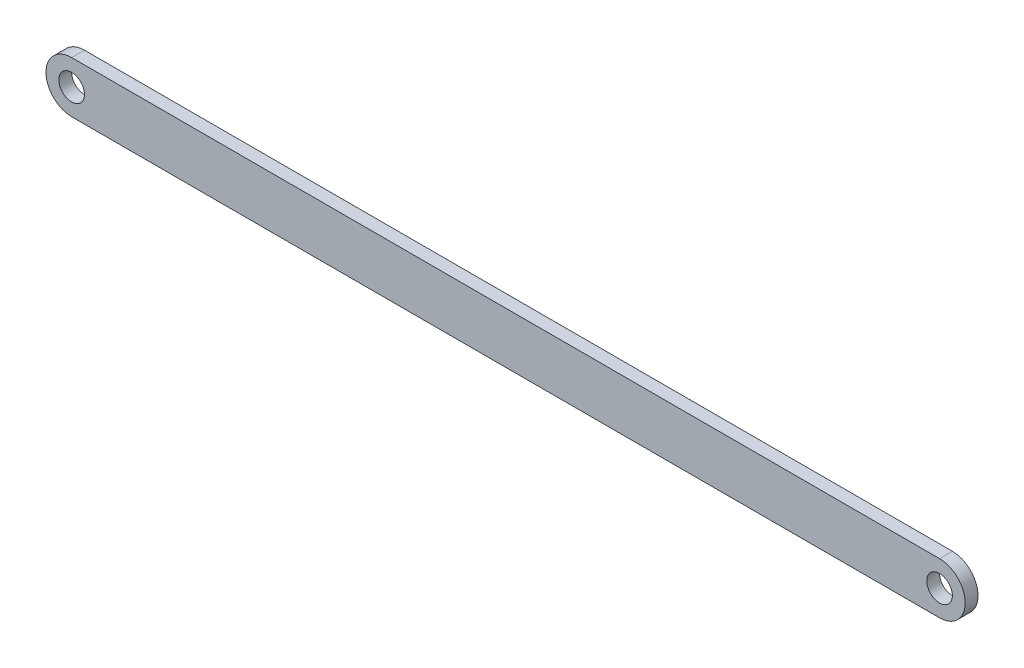
ISO-10303-21;
HEADER;
FILE_DESCRIPTION(('STEP AP214'),'2;1');
FILE_NAME('part.step','',(''),(''),'','','');
FILE_SCHEMA(('AUTOMOTIVE_DESIGN { 1 0 10303 214 1 1 1 1 }'));
ENDSEC;
DATA;
#1=APPLICATION_CONTEXT('core data for automotive mechanical design processes');
#2=APPLICATION_PROTOCOL_DEFINITION('international standard','automotive_design',2000,#1);
#3=PRODUCT_CONTEXT('',#1,'mechanical');
#4=PRODUCT('Part','Part','',(#3));
#5=PRODUCT_RELATED_PRODUCT_CATEGORY('part','',(#4));
#6=PRODUCT_DEFINITION_FORMATION('','',#4);
#7=PRODUCT_DEFINITION_CONTEXT('part definition',#1,'design');
#8=PRODUCT_DEFINITION('design','',#6,#7);
#9=PRODUCT_DEFINITION_SHAPE('','',#8);
#10=(LENGTH_UNIT() NAMED_UNIT(*) SI_UNIT(.MILLI.,.METRE.));
#11=(NAMED_UNIT(*) PLANE_ANGLE_UNIT() SI_UNIT($,.RADIAN.));
#12=(NAMED_UNIT(*) SI_UNIT($,.STERADIAN.) SOLID_ANGLE_UNIT());
#13=UNCERTAINTY_MEASURE_WITH_UNIT(LENGTH_MEASURE(1.E-05),#10,'distance_accuracy_value','');
#14=(GEOMETRIC_REPRESENTATION_CONTEXT(3) GLOBAL_UNCERTAINTY_ASSIGNED_CONTEXT((#13)) GLOBAL_UNIT_ASSIGNED_CONTEXT((#10,
#11,#12)) REPRESENTATION_CONTEXT('',''));
#15=CARTESIAN_POINT('',(0.,0.,0.));
#16=DIRECTION('',(0.,0.,1.));
#17=DIRECTION('',(1.,0.,0.));
#18=AXIS2_PLACEMENT_3D('',#15,#16,#17);
#19=CARTESIAN_POINT('',(33.855,0.,1.));
#20=DIRECTION('',(0.,0.,-1.));
#21=DIRECTION('',(-1.,0.,0.));
#22=AXIS2_PLACEMENT_3D('',#19,#20,#21);
#23=PLANE('',#22);
#24=CARTESIAN_POINT('',(33.855,0.,1.));
#25=DIRECTION('',(0.,0.,1.));
#26=DIRECTION('',(-1.,0.,0.));
#27=AXIS2_PLACEMENT_3D('',#24,#25,#26);
#28=CIRCLE('',#27,2.);
#29=CARTESIAN_POINT('',(33.855,-2.,1.));
#30=VERTEX_POINT('',#29);
#31=CARTESIAN_POINT('',(33.855,2.,1.));
#32=VERTEX_POINT('',#31);
#33=EDGE_CURVE('E96',#30,#32,#28,.T.);
#34=ORIENTED_EDGE('',*,*,#33,.T.);
#35=DIRECTION('',(-1.,0.,0.));
#36=VECTOR('',#35,1.);
#37=CARTESIAN_POINT('',(-33.855,2.,1.));
#38=LINE('',#37,#36);
#39=CARTESIAN_POINT('',(-33.855,2.,1.));
#40=VERTEX_POINT('',#39);
#41=EDGE_CURVE('E91',#32,#40,#38,.T.);
#42=ORIENTED_EDGE('',*,*,#41,.T.);
#43=CARTESIAN_POINT('',(-33.855,0.,1.));
#44=DIRECTION('',(0.,0.,1.));
#45=DIRECTION('',(1.,0.,0.));
#46=AXIS2_PLACEMENT_3D('',#43,#44,#45);
#47=CIRCLE('',#46,2.);
#48=CARTESIAN_POINT('',(-33.855,-2.,1.));
#49=VERTEX_POINT('',#48);
#50=EDGE_CURVE('E94',#40,#49,#47,.T.);
#51=ORIENTED_EDGE('',*,*,#50,.T.);
#52=DIRECTION('',(1.,0.,0.));
#53=VECTOR('',#52,1.);
#54=CARTESIAN_POINT('',(-33.855,-2.,1.));
#55=LINE('',#54,#53);
#56=EDGE_CURVE('E61',#49,#30,#55,.T.);
#57=ORIENTED_EDGE('',*,*,#56,.T.);
#58=EDGE_LOOP('',(#34,#42,#51,#57));
#59=FACE_BOUND('',#58,.T.);
#60=CARTESIAN_POINT('',(-33.855,0.,1.));
#61=DIRECTION('',(0.,0.,1.));
#62=DIRECTION('',(1.,0.,0.));
#63=AXIS2_PLACEMENT_3D('',#60,#61,#62);
#64=CIRCLE('',#63,0.999999999999998);
#65=CARTESIAN_POINT('',(-32.855,0.,1.));
#66=VERTEX_POINT('',#65);
#67=EDGE_CURVE('E116',#66,#66,#64,.T.);
#68=ORIENTED_EDGE('',*,*,#67,.F.);
#69=EDGE_LOOP('',(#68));
#70=FACE_BOUND('',#69,.T.);
#71=CARTESIAN_POINT('',(33.855,0.,1.));
#72=DIRECTION('',(0.,0.,1.));
#73=DIRECTION('',(1.,0.,0.));
#74=AXIS2_PLACEMENT_3D('',#71,#72,#73);
#75=CIRCLE('',#74,0.999999999999998);
#76=CARTESIAN_POINT('',(34.855,0.,1.));
#77=VERTEX_POINT('',#76);
#78=EDGE_CURVE('E138',#77,#77,#75,.T.);
#79=ORIENTED_EDGE('',*,*,#78,.F.);
#80=EDGE_LOOP('',(#79));
#81=FACE_BOUND('',#80,.T.);
#82=ADVANCED_FACE('F43',(#59,#70,#81),#23,.F.);
#83=CARTESIAN_POINT('',(33.855,0.,0.));
#84=DIRECTION('',(0.,0.,-1.));
#85=DIRECTION('',(-1.,0.,0.));
#86=AXIS2_PLACEMENT_3D('',#83,#84,#85);
#87=PLANE('',#86);
#88=CARTESIAN_POINT('',(-33.855,0.,0.));
#89=DIRECTION('',(0.,0.,1.));
#90=DIRECTION('',(1.,0.,0.));
#91=AXIS2_PLACEMENT_3D('',#88,#89,#90);
#92=CIRCLE('',#91,0.999999999999998);
#93=CARTESIAN_POINT('',(-32.855,0.,0.));
#94=VERTEX_POINT('',#93);
#95=EDGE_CURVE('E134',#94,#94,#92,.T.);
#96=ORIENTED_EDGE('',*,*,#95,.T.);
#97=EDGE_LOOP('',(#96));
#98=FACE_BOUND('',#97,.T.);
#99=CARTESIAN_POINT('',(33.855,0.,0.));
#100=DIRECTION('',(0.,0.,1.));
#101=DIRECTION('',(-1.,0.,0.));
#102=AXIS2_PLACEMENT_3D('',#99,#100,#101);
#103=CIRCLE('',#102,2.);
#104=CARTESIAN_POINT('',(33.855,-2.,0.));
#105=VERTEX_POINT('',#104);
#106=CARTESIAN_POINT('',(33.855,2.,0.));
#107=VERTEX_POINT('',#106);
#108=EDGE_CURVE('E112',#105,#107,#103,.T.);
#109=ORIENTED_EDGE('',*,*,#108,.F.);
#110=DIRECTION('',(1.,0.,0.));
#111=VECTOR('',#110,1.);
#112=CARTESIAN_POINT('',(-33.855,-2.,0.));
#113=LINE('',#112,#111);
#114=CARTESIAN_POINT('',(-33.855,-2.,0.));
#115=VERTEX_POINT('',#114);
#116=EDGE_CURVE('E84',#115,#105,#113,.T.);
#117=ORIENTED_EDGE('',*,*,#116,.F.);
#118=CARTESIAN_POINT('',(-33.855,0.,0.));
#119=DIRECTION('',(0.,0.,1.));
#120=DIRECTION('',(1.,0.,0.));
#121=AXIS2_PLACEMENT_3D('',#118,#119,#120);
#122=CIRCLE('',#121,2.);
#123=CARTESIAN_POINT('',(-33.855,2.,0.));
#124=VERTEX_POINT('',#123);
#125=EDGE_CURVE('E78',#124,#115,#122,.T.);
#126=ORIENTED_EDGE('',*,*,#125,.F.);
#127=DIRECTION('',(-1.,0.,0.));
#128=VECTOR('',#127,1.);
#129=CARTESIAN_POINT('',(-33.855,2.,0.));
#130=LINE('',#129,#128);
#131=EDGE_CURVE('E101',#107,#124,#130,.T.);
#132=ORIENTED_EDGE('',*,*,#131,.F.);
#133=EDGE_LOOP('',(#109,#117,#126,#132));
#134=FACE_BOUND('',#133,.T.);
#135=CARTESIAN_POINT('',(33.855,0.,0.));
#136=DIRECTION('',(0.,0.,1.));
#137=DIRECTION('',(1.,0.,0.));
#138=AXIS2_PLACEMENT_3D('',#135,#136,#137);
#139=CIRCLE('',#138,0.999999999999998);
#140=CARTESIAN_POINT('',(34.855,0.,0.));
#141=VERTEX_POINT('',#140);
#142=EDGE_CURVE('E142',#141,#141,#139,.T.);
#143=ORIENTED_EDGE('',*,*,#142,.T.);
#144=EDGE_LOOP('',(#143));
#145=FACE_BOUND('',#144,.T.);
#146=ADVANCED_FACE('F129',(#98,#134,#145),#87,.T.);
#147=CARTESIAN_POINT('',(33.855,0.,1.));
#148=DIRECTION('',(0.,0.,-1.));
#149=DIRECTION('',(-1.,0.,0.));
#150=AXIS2_PLACEMENT_3D('',#147,#148,#149);
#151=CYLINDRICAL_SURFACE('',#150,2.);
#152=ORIENTED_EDGE('',*,*,#108,.T.);
#153=DIRECTION('',(0.,0.,-1.));
#154=VECTOR('',#153,1.);
#155=CARTESIAN_POINT('',(33.855,2.,1.));
#156=LINE('',#155,#154);
#157=EDGE_CURVE('E11',#32,#107,#156,.T.);
#158=ORIENTED_EDGE('',*,*,#157,.F.);
#159=ORIENTED_EDGE('',*,*,#33,.F.);
#160=DIRECTION('',(0.,0.,-1.));
#161=VECTOR('',#160,1.);
#162=CARTESIAN_POINT('',(33.855,-2.,1.));
#163=LINE('',#162,#161);
#164=EDGE_CURVE('E108',#30,#105,#163,.T.);
#165=ORIENTED_EDGE('',*,*,#164,.T.);
#166=EDGE_LOOP('',(#152,#158,#159,#165));
#167=FACE_BOUND('',#166,.T.);
#168=ADVANCED_FACE('F45',(#167),#151,.T.);
#169=CARTESIAN_POINT('',(-33.855,2.,1.));
#170=DIRECTION('',(0.,-1.,0.));
#171=DIRECTION('',(0.,0.,-1.));
#172=AXIS2_PLACEMENT_3D('',#169,#170,#171);
#173=PLANE('',#172);
#174=ORIENTED_EDGE('',*,*,#131,.T.);
#175=DIRECTION('',(0.,0.,-1.));
#176=VECTOR('',#175,1.);
#177=CARTESIAN_POINT('',(-33.855,2.,1.));
#178=LINE('',#177,#176);
#179=EDGE_CURVE('E53',#40,#124,#178,.T.);
#180=ORIENTED_EDGE('',*,*,#179,.F.);
#181=ORIENTED_EDGE('',*,*,#41,.F.);
#182=ORIENTED_EDGE('',*,*,#157,.T.);
#183=EDGE_LOOP('',(#174,#180,#181,#182));
#184=FACE_BOUND('',#183,.T.);
#185=ADVANCED_FACE('F100',(#184),#173,.F.);
#186=CARTESIAN_POINT('',(-33.855,0.,1.));
#187=DIRECTION('',(0.,0.,-1.));
#188=DIRECTION('',(-1.,0.,0.));
#189=AXIS2_PLACEMENT_3D('',#186,#187,#188);
#190=CYLINDRICAL_SURFACE('',#189,2.);
#191=ORIENTED_EDGE('',*,*,#125,.T.);
#192=DIRECTION('',(0.,0.,-1.));
#193=VECTOR('',#192,1.);
#194=CARTESIAN_POINT('',(-33.855,-2.,1.));
#195=LINE('',#194,#193);
#196=EDGE_CURVE('E103',#49,#115,#195,.T.);
#197=ORIENTED_EDGE('',*,*,#196,.F.);
#198=ORIENTED_EDGE('',*,*,#50,.F.);
#199=ORIENTED_EDGE('',*,*,#179,.T.);
#200=EDGE_LOOP('',(#191,#197,#198,#199));
#201=FACE_BOUND('',#200,.T.);
#202=ADVANCED_FACE('F104',(#201),#190,.T.);
#203=CARTESIAN_POINT('',(-33.855,-2.,1.));
#204=DIRECTION('',(0.,1.,0.));
#205=DIRECTION('',(0.,0.,1.));
#206=AXIS2_PLACEMENT_3D('',#203,#204,#205);
#207=PLANE('',#206);
#208=ORIENTED_EDGE('',*,*,#116,.T.);
#209=ORIENTED_EDGE('',*,*,#164,.F.);
#210=ORIENTED_EDGE('',*,*,#56,.F.);
#211=ORIENTED_EDGE('',*,*,#196,.T.);
#212=EDGE_LOOP('',(#208,#209,#210,#211));
#213=FACE_BOUND('',#212,.T.);
#214=ADVANCED_FACE('F126',(#213),#207,.F.);
#215=CARTESIAN_POINT('',(-33.855,0.,1.));
#216=DIRECTION('',(0.,0.,-1.));
#217=DIRECTION('',(-1.,0.,0.));
#218=AXIS2_PLACEMENT_3D('',#215,#216,#217);
#219=CYLINDRICAL_SURFACE('',#218,0.999999999999998);
#220=ORIENTED_EDGE('',*,*,#67,.T.);
#221=EDGE_LOOP('',(#220));
#222=FACE_BOUND('',#221,.T.);
#223=ORIENTED_EDGE('',*,*,#95,.F.);
#224=EDGE_LOOP('',(#223));
#225=FACE_BOUND('',#224,.T.);
#226=ADVANCED_FACE('F161',(#222,#225),#219,.F.);
#227=CARTESIAN_POINT('',(33.855,0.,1.));
#228=DIRECTION('',(0.,0.,-1.));
#229=DIRECTION('',(-1.,0.,0.));
#230=AXIS2_PLACEMENT_3D('',#227,#228,#229);
#231=CYLINDRICAL_SURFACE('',#230,0.999999999999998);
#232=ORIENTED_EDGE('',*,*,#78,.T.);
#233=EDGE_LOOP('',(#232));
#234=FACE_BOUND('',#233,.T.);
#235=ORIENTED_EDGE('',*,*,#142,.F.);
#236=EDGE_LOOP('',(#235));
#237=FACE_BOUND('',#236,.T.);
#238=ADVANCED_FACE('F150',(#234,#237),#231,.F.);
#239=CLOSED_SHELL('',(#82,#146,#168,#185,#202,#214,#226,#238));
#240=MANIFOLD_SOLID_BREP('B2',#239);
#241=ADVANCED_BREP_SHAPE_REPRESENTATION('',(#18,#240),#14);
#242=SHAPE_DEFINITION_REPRESENTATION(#9,#241);
ENDSEC;
END-ISO-10303-21;
